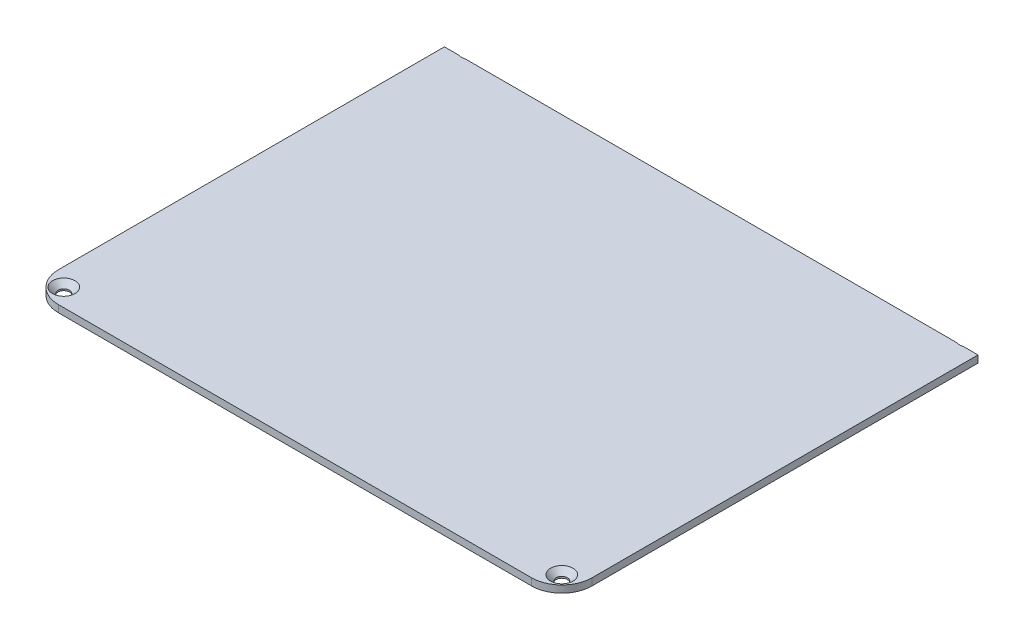
ISO-10303-21;
HEADER;
FILE_DESCRIPTION(('STEP AP214'),'2;1');
FILE_NAME('part.step','',(''),(''),'','','');
FILE_SCHEMA(('AUTOMOTIVE_DESIGN { 1 0 10303 214 1 1 1 1 }'));
ENDSEC;
DATA;
#1=APPLICATION_CONTEXT('core data for automotive mechanical design processes');
#2=APPLICATION_PROTOCOL_DEFINITION('international standard','automotive_design',2000,#1);
#3=PRODUCT_CONTEXT('',#1,'mechanical');
#4=PRODUCT('Part','Part','',(#3));
#5=PRODUCT_RELATED_PRODUCT_CATEGORY('part','',(#4));
#6=PRODUCT_DEFINITION_FORMATION('','',#4);
#7=PRODUCT_DEFINITION_CONTEXT('part definition',#1,'design');
#8=PRODUCT_DEFINITION('design','',#6,#7);
#9=PRODUCT_DEFINITION_SHAPE('','',#8);
#10=(LENGTH_UNIT() NAMED_UNIT(*) SI_UNIT(.MILLI.,.METRE.));
#11=(NAMED_UNIT(*) PLANE_ANGLE_UNIT() SI_UNIT($,.RADIAN.));
#12=(NAMED_UNIT(*) SI_UNIT($,.STERADIAN.) SOLID_ANGLE_UNIT());
#13=UNCERTAINTY_MEASURE_WITH_UNIT(LENGTH_MEASURE(1.E-05),#10,'distance_accuracy_value','');
#14=(GEOMETRIC_REPRESENTATION_CONTEXT(3) GLOBAL_UNCERTAINTY_ASSIGNED_CONTEXT((#13)) GLOBAL_UNIT_ASSIGNED_CONTEXT((#10,
#11,#12)) REPRESENTATION_CONTEXT('',''));
#15=CARTESIAN_POINT('',(0.,0.,0.));
#16=DIRECTION('',(0.,0.,1.));
#17=DIRECTION('',(1.,0.,0.));
#18=AXIS2_PLACEMENT_3D('',#15,#16,#17);
#19=CARTESIAN_POINT('',(0.,4.,0.));
#20=DIRECTION('',(0.,-1.,0.));
#21=DIRECTION('',(0.,0.,-1.));
#22=AXIS2_PLACEMENT_3D('',#19,#20,#21);
#23=PLANE('',#22);
#24=CARTESIAN_POINT('',(10.,4.,-10.));
#25=DIRECTION('',(0.,1.,0.));
#26=DIRECTION('',(0.,0.,1.));
#27=AXIS2_PLACEMENT_3D('',#24,#25,#26);
#28=CIRCLE('',#27,6.3);
#29=CARTESIAN_POINT('',(10.,4.,-3.7));
#30=VERTEX_POINT('',#29);
#31=EDGE_CURVE('E236',#30,#30,#28,.T.);
#32=ORIENTED_EDGE('',*,*,#31,.F.);
#33=EDGE_LOOP('',(#32));
#34=FACE_BOUND('',#33,.T.);
#35=CARTESIAN_POINT('',(290.,4.,-10.));
#36=DIRECTION('',(0.,1.,0.));
#37=DIRECTION('',(0.,0.,1.));
#38=AXIS2_PLACEMENT_3D('',#35,#36,#37);
#39=CIRCLE('',#38,6.29999999999997);
#40=CARTESIAN_POINT('',(290.,4.,-3.70000000000003));
#41=VERTEX_POINT('',#40);
#42=EDGE_CURVE('E229',#41,#41,#39,.T.);
#43=ORIENTED_EDGE('',*,*,#42,.F.);
#44=EDGE_LOOP('',(#43));
#45=FACE_BOUND('',#44,.T.);
#46=CARTESIAN_POINT('',(290.,4.,-240.));
#47=DIRECTION('',(0.,1.,0.));
#48=DIRECTION('',(0.,0.,1.));
#49=AXIS2_PLACEMENT_3D('',#46,#47,#48);
#50=CIRCLE('',#49,6.29999999999997);
#51=CARTESIAN_POINT('',(288.07906272877,4.,-234.));
#52=VERTEX_POINT('',#51);
#53=CARTESIAN_POINT('',(291.92093727123,4.,-234.));
#54=VERTEX_POINT('',#53);
#55=EDGE_CURVE('E58',#52,#54,#50,.T.);
#56=ORIENTED_EDGE('',*,*,#55,.F.);
#57=DIRECTION('',(-1.,0.,0.));
#58=VECTOR('',#57,1.);
#59=CARTESIAN_POINT('',(0.,4.,-234.));
#60=LINE('',#59,#58);
#61=CARTESIAN_POINT('',(11.9209372712298,4.,-234.));
#62=VERTEX_POINT('',#61);
#63=EDGE_CURVE('E64',#52,#62,#60,.T.);
#64=ORIENTED_EDGE('',*,*,#63,.T.);
#65=CARTESIAN_POINT('',(10.,4.,-240.));
#66=DIRECTION('',(0.,1.,0.));
#67=DIRECTION('',(0.,0.,1.));
#68=AXIS2_PLACEMENT_3D('',#65,#66,#67);
#69=CIRCLE('',#68,6.3);
#70=CARTESIAN_POINT('',(8.07906272877016,4.,-234.));
#71=VERTEX_POINT('',#70);
#72=EDGE_CURVE('E111',#71,#62,#69,.T.);
#73=ORIENTED_EDGE('',*,*,#72,.F.);
#74=CARTESIAN_POINT('',(0.,4.,-234.));
#75=VERTEX_POINT('',#74);
#76=EDGE_CURVE('E118',#71,#75,#60,.T.);
#77=ORIENTED_EDGE('',*,*,#76,.T.);
#78=DIRECTION('',(0.,0.,1.));
#79=VECTOR('',#78,1.);
#80=CARTESIAN_POINT('',(0.,4.,0.));
#81=LINE('',#80,#79);
#82=CARTESIAN_POINT('',(0.,4.,-17.));
#83=VERTEX_POINT('',#82);
#84=EDGE_CURVE('E140',#75,#83,#81,.T.);
#85=ORIENTED_EDGE('',*,*,#84,.T.);
#86=CARTESIAN_POINT('',(17.,4.,-17.));
#87=DIRECTION('',(0.,-1.,0.));
#88=DIRECTION('',(0.,0.,-1.));
#89=AXIS2_PLACEMENT_3D('',#86,#87,#88);
#90=CIRCLE('',#89,17.);
#91=CARTESIAN_POINT('',(17.,4.,0.));
#92=VERTEX_POINT('',#91);
#93=EDGE_CURVE('E158',#83,#92,#90,.F.);
#94=ORIENTED_EDGE('',*,*,#93,.T.);
#95=DIRECTION('',(1.,0.,0.));
#96=VECTOR('',#95,1.);
#97=CARTESIAN_POINT('',(0.,4.,0.));
#98=LINE('',#97,#96);
#99=CARTESIAN_POINT('',(283.,4.,0.));
#100=VERTEX_POINT('',#99);
#101=EDGE_CURVE('E218',#92,#100,#98,.T.);
#102=ORIENTED_EDGE('',*,*,#101,.T.);
#103=CARTESIAN_POINT('',(283.,4.,-17.));
#104=DIRECTION('',(0.,-1.,0.));
#105=DIRECTION('',(0.,0.,-1.));
#106=AXIS2_PLACEMENT_3D('',#103,#104,#105);
#107=CIRCLE('',#106,17.);
#108=CARTESIAN_POINT('',(300.,4.,-17.));
#109=VERTEX_POINT('',#108);
#110=EDGE_CURVE('E160',#100,#109,#107,.F.);
#111=ORIENTED_EDGE('',*,*,#110,.T.);
#112=DIRECTION('',(0.,0.,-1.));
#113=VECTOR('',#112,1.);
#114=CARTESIAN_POINT('',(300.,4.,0.));
#115=LINE('',#114,#113);
#116=CARTESIAN_POINT('',(300.,4.,-234.));
#117=VERTEX_POINT('',#116);
#118=EDGE_CURVE('E123',#109,#117,#115,.T.);
#119=ORIENTED_EDGE('',*,*,#118,.T.);
#120=EDGE_CURVE('E110',#117,#54,#60,.T.);
#121=ORIENTED_EDGE('',*,*,#120,.T.);
#122=EDGE_LOOP('',(#56,#64,#73,#77,#85,#94,#102,#111,#119,#121));
#123=FACE_BOUND('',#122,.T.);
#124=ADVANCED_FACE('F39',(#34,#45,#123),#23,.F.);
#125=CARTESIAN_POINT('',(0.,4.,0.));
#126=DIRECTION('',(1.,0.,0.));
#127=DIRECTION('',(0.,0.,-1.));
#128=AXIS2_PLACEMENT_3D('',#125,#126,#127);
#129=PLANE('',#128);
#130=DIRECTION('',(0.,0.,1.));
#131=VECTOR('',#130,1.);
#132=CARTESIAN_POINT('',(0.,0.,0.));
#133=LINE('',#132,#131);
#134=CARTESIAN_POINT('',(0.,0.,-234.));
#135=VERTEX_POINT('',#134);
#136=CARTESIAN_POINT('',(0.,0.,-17.));
#137=VERTEX_POINT('',#136);
#138=EDGE_CURVE('E127',#135,#137,#133,.T.);
#139=ORIENTED_EDGE('',*,*,#138,.T.);
#140=DIRECTION('',(0.,-1.,0.));
#141=VECTOR('',#140,1.);
#142=CARTESIAN_POINT('',(0.,4.,-17.));
#143=LINE('',#142,#141);
#144=EDGE_CURVE('E162',#137,#83,#143,.F.);
#145=ORIENTED_EDGE('',*,*,#144,.T.);
#146=ORIENTED_EDGE('',*,*,#84,.F.);
#147=DIRECTION('',(0.,-1.,0.));
#148=VECTOR('',#147,1.);
#149=CARTESIAN_POINT('',(0.,4.,-234.));
#150=LINE('',#149,#148);
#151=EDGE_CURVE('E122',#75,#135,#150,.T.);
#152=ORIENTED_EDGE('',*,*,#151,.T.);
#153=EDGE_LOOP('',(#139,#145,#146,#152));
#154=FACE_BOUND('',#153,.T.);
#155=ADVANCED_FACE('F178',(#154),#129,.F.);
#156=CARTESIAN_POINT('',(0.,4.,0.));
#157=DIRECTION('',(0.,0.,-1.));
#158=DIRECTION('',(-1.,0.,0.));
#159=AXIS2_PLACEMENT_3D('',#156,#157,#158);
#160=PLANE('',#159);
#161=DIRECTION('',(1.,0.,0.));
#162=VECTOR('',#161,1.);
#163=CARTESIAN_POINT('',(0.,0.,0.));
#164=LINE('',#163,#162);
#165=CARTESIAN_POINT('',(17.,0.,0.));
#166=VERTEX_POINT('',#165);
#167=CARTESIAN_POINT('',(283.,0.,0.));
#168=VERTEX_POINT('',#167);
#169=EDGE_CURVE('E131',#166,#168,#164,.T.);
#170=ORIENTED_EDGE('',*,*,#169,.T.);
#171=DIRECTION('',(0.,-1.,0.));
#172=VECTOR('',#171,1.);
#173=CARTESIAN_POINT('',(283.,4.,0.));
#174=LINE('',#173,#172);
#175=EDGE_CURVE('E156',#168,#100,#174,.F.);
#176=ORIENTED_EDGE('',*,*,#175,.T.);
#177=ORIENTED_EDGE('',*,*,#101,.F.);
#178=DIRECTION('',(0.,-1.,0.));
#179=VECTOR('',#178,1.);
#180=CARTESIAN_POINT('',(17.,4.,0.));
#181=LINE('',#180,#179);
#182=EDGE_CURVE('E153',#92,#166,#181,.T.);
#183=ORIENTED_EDGE('',*,*,#182,.T.);
#184=EDGE_LOOP('',(#170,#176,#177,#183));
#185=FACE_BOUND('',#184,.T.);
#186=ADVANCED_FACE('F215',(#185),#160,.F.);
#187=CARTESIAN_POINT('',(300.,4.,0.));
#188=DIRECTION('',(-1.,0.,0.));
#189=DIRECTION('',(0.,0.,1.));
#190=AXIS2_PLACEMENT_3D('',#187,#188,#189);
#191=PLANE('',#190);
#192=ORIENTED_EDGE('',*,*,#118,.F.);
#193=DIRECTION('',(0.,-1.,0.));
#194=VECTOR('',#193,1.);
#195=CARTESIAN_POINT('',(300.,4.,-17.));
#196=LINE('',#195,#194);
#197=CARTESIAN_POINT('',(300.,0.,-17.));
#198=VERTEX_POINT('',#197);
#199=EDGE_CURVE('E146',#109,#198,#196,.T.);
#200=ORIENTED_EDGE('',*,*,#199,.T.);
#201=DIRECTION('',(0.,0.,-1.));
#202=VECTOR('',#201,1.);
#203=CARTESIAN_POINT('',(300.,0.,0.));
#204=LINE('',#203,#202);
#205=CARTESIAN_POINT('',(300.,0.,-234.));
#206=VERTEX_POINT('',#205);
#207=EDGE_CURVE('E135',#198,#206,#204,.T.);
#208=ORIENTED_EDGE('',*,*,#207,.T.);
#209=DIRECTION('',(0.,-1.,0.));
#210=VECTOR('',#209,1.);
#211=CARTESIAN_POINT('',(300.,4.,-234.));
#212=LINE('',#211,#210);
#213=EDGE_CURVE('E143',#117,#206,#212,.T.);
#214=ORIENTED_EDGE('',*,*,#213,.F.);
#215=EDGE_LOOP('',(#192,#200,#208,#214));
#216=FACE_BOUND('',#215,.T.);
#217=ADVANCED_FACE('F189',(#216),#191,.F.);
#218=CARTESIAN_POINT('',(0.,4.,-234.));
#219=DIRECTION('',(0.,0.,1.));
#220=DIRECTION('',(1.,0.,0.));
#221=AXIS2_PLACEMENT_3D('',#218,#219,#220);
#222=PLANE('',#221);
#223=ORIENTED_EDGE('',*,*,#63,.F.);
#224=CARTESIAN_POINT('',(269.190245400378,19.3574672225657,-234.));
#225=CARTESIAN_POINT('',(269.709030300661,18.8590335236249,-234.));
#226=CARTESIAN_POINT('',(270.228488505162,18.361297390707,-234.));
#227=CARTESIAN_POINT('',(271.269225122258,17.3676755174882,-234.));
#228=CARTESIAN_POINT('',(271.79050363237,16.8717898793595,-234.));
#229=CARTESIAN_POINT('',(272.83676578259,15.880988721276,-234.));
#230=CARTESIAN_POINT('',(273.36175571768,15.3860798411432,-234.));
#231=CARTESIAN_POINT('',(274.414634628033,14.3993970225166,-234.));
#232=CARTESIAN_POINT('',(274.942523485217,13.9076229580727,-234.));
#233=CARTESIAN_POINT('',(276.065632732858,12.8695397292352,-234.));
#234=CARTESIAN_POINT('',(276.661341408261,12.323757094228,-234.));
#235=CARTESIAN_POINT('',(277.560073295153,11.5107080589867,-234.));
#236=CARTESIAN_POINT('',(277.860534150705,11.2406097248272,-234.));
#237=CARTESIAN_POINT('',(278.463535427959,10.7027450238927,-234.));
#238=CARTESIAN_POINT('',(278.766075837923,10.4349786439732,-234.));
#239=CARTESIAN_POINT('',(279.373198832351,9.90277008944649,-234.));
#240=CARTESIAN_POINT('',(279.677777288132,9.63832321095495,-234.));
#241=CARTESIAN_POINT('',(280.290057352683,9.11307180039887,-234.));
#242=CARTESIAN_POINT('',(280.597758914883,8.85226721415961,-234.));
#243=CARTESIAN_POINT('',(281.217010890757,8.33540354769458,-234.));
#244=CARTESIAN_POINT('',(281.528560411096,8.07934339928055,-234.));
#245=CARTESIAN_POINT('',(282.156619244923,7.5733937702437,-234.));
#246=CARTESIAN_POINT('',(282.473128201179,7.32350384848325,-234.));
#247=CARTESIAN_POINT('',(282.992945184643,6.92401777257441,-234.));
#248=CARTESIAN_POINT('',(283.194298076628,6.77187956898466,-234.));
#249=CARTESIAN_POINT('',(283.599998246704,6.47162371897631,-234.));
#250=CARTESIAN_POINT('',(283.804345618082,6.32350619822472,-234.));
#251=CARTESIAN_POINT('',(284.216948334804,6.03200613485343,-234.));
#252=CARTESIAN_POINT('',(284.425209996336,5.88863250211753,-234.));
#253=CARTESIAN_POINT('',(284.845949351493,5.60820015951851,-234.));
#254=CARTESIAN_POINT('',(285.058426856514,5.47114116806479,-234.));
#255=CARTESIAN_POINT('',(285.484097049575,5.20772799955743,-234.));
#256=CARTESIAN_POINT('',(285.697190702347,5.08121469703576,-234.));
#257=CARTESIAN_POINT('',(286.129067286359,4.83808481964387,-234.));
#258=CARTESIAN_POINT('',(286.347851577447,4.72147063920677,-234.));
#259=CARTESIAN_POINT('',(286.791188024546,4.5014370609496,-234.));
#260=CARTESIAN_POINT('',(287.015720630059,4.39797863876526,-234.));
#261=CARTESIAN_POINT('',(287.471652475265,4.20766618311422,-234.));
#262=CARTESIAN_POINT('',(287.703046219558,4.1207992547408,-234.));
#263=CARTESIAN_POINT('',(288.087096298579,3.9959745112749,-234.));
#264=CARTESIAN_POINT('',(288.237711294082,3.95173018079003,-234.));
#265=CARTESIAN_POINT('',(288.541509479053,3.87297982880822,-234.));
#266=CARTESIAN_POINT('',(288.694692882717,3.83847462384336,-234.));
#267=CARTESIAN_POINT('',(289.002718588543,3.78044159972715,-234.));
#268=CARTESIAN_POINT('',(289.157555289801,3.75688437073816,-234.));
#269=CARTESIAN_POINT('',(289.468562086524,3.72150763580314,-234.));
#270=CARTESIAN_POINT('',(289.624732095206,3.70968737169728,-234.));
#271=CARTESIAN_POINT('',(289.971634582504,3.69705167238178,-234.));
#272=CARTESIAN_POINT('',(290.162483525692,3.69919526679001,-234.));
#273=CARTESIAN_POINT('',(290.543117649831,3.7215315418545,-234.));
#274=CARTESIAN_POINT('',(290.732902676803,3.74172677053325,-234.));
#275=CARTESIAN_POINT('',(291.110661532791,3.79906102050487,-234.));
#276=CARTESIAN_POINT('',(291.298624665707,3.83626956943628,-234.));
#277=CARTESIAN_POINT('',(291.670897652874,3.92569074398454,-234.));
#278=CARTESIAN_POINT('',(291.855207038133,3.97790528259125,-234.));
#279=CARTESIAN_POINT('',(292.395660376726,4.1516647640086,-234.));
#280=CARTESIAN_POINT('',(292.745964119443,4.29148543523251,-234.));
#281=CARTESIAN_POINT('',(293.259519205313,4.52651335587914,-234.));
#282=CARTESIAN_POINT('',(293.428879868628,4.60916497044079,-234.));
#283=CARTESIAN_POINT('',(293.764019058669,4.78146743049723,-234.));
#284=CARTESIAN_POINT('',(293.929797934381,4.87111759014037,-234.));
#285=CARTESIAN_POINT('',(294.260427765172,5.05746779421679,-234.));
#286=CARTESIAN_POINT('',(294.425231982083,5.15424997694629,-234.));
#287=CARTESIAN_POINT('',(294.751880789206,5.35268216740628,-234.));
#288=CARTESIAN_POINT('',(294.913725317771,5.45433227637172,-234.));
#289=CARTESIAN_POINT('',(295.234667087149,5.66157903639564,-234.));
#290=CARTESIAN_POINT('',(295.393766506922,5.76717232484793,-234.));
#291=CARTESIAN_POINT('',(295.709667923513,5.98171926249003,-234.));
#292=CARTESIAN_POINT('',(295.866470015024,6.09067277259986,-234.));
#293=CARTESIAN_POINT('',(296.201029397036,6.3276783867472,-234.));
#294=CARTESIAN_POINT('',(296.378468863534,6.45617851006558,-234.));
#295=CARTESIAN_POINT('',(296.731069455399,6.71627193824177,-234.));
#296=CARTESIAN_POINT('',(296.906230498284,6.84786535459858,-234.));
#297=CARTESIAN_POINT('',(297.428820044469,7.24653967267187,-234.));
#298=CARTESIAN_POINT('',(297.773305367359,7.5174790716851,-234.));
#299=CARTESIAN_POINT('',(298.456546745393,8.06687377373283,-234.));
#300=CARTESIAN_POINT('',(298.795299052251,8.34533370672021,-234.));
#301=CARTESIAN_POINT('',(299.46819589452,8.90770378620207,-234.));
#302=CARTESIAN_POINT('',(299.802340776933,9.19161351835868,-234.));
#303=CARTESIAN_POINT('',(300.467930951895,9.76436058495172,-234.));
#304=CARTESIAN_POINT('',(300.799366617077,10.0532090805222,-234.));
#305=CARTESIAN_POINT('',(301.459372065764,10.6341681609186,-234.));
#306=CARTESIAN_POINT('',(301.787941802019,10.9262787993471,-234.));
#307=CARTESIAN_POINT('',(302.442645034994,11.5129767071093,-234.));
#308=CARTESIAN_POINT('',(302.768779372462,11.8075630393165,-234.));
#309=CARTESIAN_POINT('',(303.419152801773,12.3988215231793,-234.));
#310=CARTESIAN_POINT('',(303.743391884673,12.695493684663,-234.));
#311=CARTESIAN_POINT('',(304.634466232775,13.5151128786331,-234.));
#312=CARTESIAN_POINT('',(305.199678538602,14.0398239642659,-234.));
#313=CARTESIAN_POINT('',(306.326631262988,15.0930711044456,-234.));
#314=CARTESIAN_POINT('',(306.888371314176,15.6216075513023,-234.));
#315=CARTESIAN_POINT('',(308.006409527906,16.6788766003369,-234.));
#316=CARTESIAN_POINT('',(308.562720863827,17.2075952840056,-234.));
#317=CARTESIAN_POINT('',(309.673193598743,18.2671493132842,-234.));
#318=CARTESIAN_POINT('',(310.227355254908,18.7979843892692,-234.));
#319=CARTESIAN_POINT('',(310.780756658266,19.3296058052403,-234.));
#320=B_SPLINE_CURVE_WITH_KNOTS('',3,(#224,#225,#226,#227,#228,#229,#230,#231,#232,#233,#234,
#235,#236,#237,#238,#239,#240,#241,#242,#243,#244,#245,#246,#247,#248,#249,#250,#251,#252,#253,
#254,#255,#256,#257,#258,#259,#260,#261,#262,#263,#264,#265,#266,#267,#268,#269,#270,#271,#272,
#273,#274,#275,#276,#277,#278,#279,#280,#281,#282,#283,#284,#285,#286,#287,#288,#289,#290,#291,
#292,#293,#294,#295,#296,#297,#298,#299,#300,#301,#302,#303,#304,#305,#306,#307,#308,#309,#310,
#311,#312,#313,#314,#315,#316,#317,#318,#319),.UNSPECIFIED.,.F.,.F.,(4,2,2,2,2,2,2,2,2,2,2,2,2,
2,2,2,2,2,2,2,2,2,2,2,2,2,2,2,2,2,2,2,2,2,2,2,2,2,2,2,2,2,2,2,2,2,2,4),(0.,2.15828093939026,
4.316679332126,6.48114180585279,8.64551676096695,11.0692478801546,12.2812900795891,
13.4933254426287,14.7033867412884,15.9134300225255,17.1231974738996,18.3328781815709,
19.0899398623899,19.847025178097,20.6054598790625,21.363860726134,22.1071149201384,
22.8505483857259,23.5917224133614,24.332318035527,24.8029822449534,25.2736859033372,
25.7431176830574,26.2125191374352,26.7841987064211,27.3559589818094,27.93007702296,
28.5042682861755,29.632638608174,30.1979254503483,30.7631569642556,31.3364281993593,
31.9097113615758,32.4825163378438,33.055297637381,33.7125027959609,34.3697316802046,
35.6843724726941,36.9998419413386,38.315211790383,39.6341046346207,40.9530191824582,
42.2714551515776,43.5898973371359,45.9035428434212,48.2174290860641,50.5198628381595,
52.8220120830353),.UNSPECIFIED.);
#321=EDGE_CURVE('E11',#52,#54,#320,.T.);
#322=ORIENTED_EDGE('',*,*,#321,.T.);
#323=ORIENTED_EDGE('',*,*,#120,.F.);
#324=ORIENTED_EDGE('',*,*,#213,.T.);
#325=DIRECTION('',(-1.,0.,0.));
#326=VECTOR('',#325,1.);
#327=CARTESIAN_POINT('',(0.,0.,-234.));
#328=LINE('',#327,#326);
#329=EDGE_CURVE('E138',#206,#135,#328,.T.);
#330=ORIENTED_EDGE('',*,*,#329,.T.);
#331=ORIENTED_EDGE('',*,*,#151,.F.);
#332=ORIENTED_EDGE('',*,*,#76,.F.);
#333=CARTESIAN_POINT('',(-10.8097545996226,19.3574672225658,-234.));
#334=CARTESIAN_POINT('',(-10.2909696993396,18.8590335236249,-234.));
#335=CARTESIAN_POINT('',(-9.77151149483827,18.361297390707,-234.));
#336=CARTESIAN_POINT('',(-8.73077487774222,17.3676755174882,-234.));
#337=CARTESIAN_POINT('',(-8.20949636763046,16.8717898793595,-234.));
#338=CARTESIAN_POINT('',(-7.16323421741064,15.880988721276,-234.));
#339=CARTESIAN_POINT('',(-6.63824428232061,15.3860798411432,-234.));
#340=CARTESIAN_POINT('',(-5.58536537196743,14.3993970225166,-234.));
#341=CARTESIAN_POINT('',(-5.05747651478338,13.9076229580727,-234.));
#342=CARTESIAN_POINT('',(-3.93436726714248,12.8695397292352,-234.));
#343=CARTESIAN_POINT('',(-3.33865859173926,12.323757094228,-234.));
#344=CARTESIAN_POINT('',(-2.43992670484744,11.5107080589867,-234.));
#345=CARTESIAN_POINT('',(-2.13946584929516,11.2406097248271,-234.));
#346=CARTESIAN_POINT('',(-1.53646457204055,10.7027450238927,-234.));
#347=CARTESIAN_POINT('',(-1.23392416207734,10.4349786439732,-234.));
#348=CARTESIAN_POINT('',(-0.626801167649482,9.90277008944645,-234.));
#349=CARTESIAN_POINT('',(-0.32222271186832,9.6383232109549,-234.));
#350=CARTESIAN_POINT('',(0.290057352682868,9.11307180039882,-234.));
#351=CARTESIAN_POINT('',(0.597758914882627,8.85226721415955,-234.));
#352=CARTESIAN_POINT('',(1.21701089075719,8.33540354769453,-234.));
#353=CARTESIAN_POINT('',(1.52856041109612,8.07934339928049,-234.));
#354=CARTESIAN_POINT('',(2.15661924492341,7.57339377024363,-234.));
#355=CARTESIAN_POINT('',(2.47312820117899,7.32350384848318,-234.));
#356=CARTESIAN_POINT('',(2.99294518464343,6.92401777257432,-234.));
#357=CARTESIAN_POINT('',(3.1942980766277,6.77187956898457,-234.));
#358=CARTESIAN_POINT('',(3.59999824670386,6.47162371897621,-234.));
#359=CARTESIAN_POINT('',(3.80434561808196,6.32350619822462,-234.));
#360=CARTESIAN_POINT('',(4.21694833480381,6.03200613485333,-234.));
#361=CARTESIAN_POINT('',(4.42520999633589,5.88863250211744,-234.));
#362=CARTESIAN_POINT('',(4.845949351493,5.60820015951842,-234.));
#363=CARTESIAN_POINT('',(5.05842685651404,5.4711411680647,-234.));
#364=CARTESIAN_POINT('',(5.48409704957491,5.20772799955736,-234.));
#365=CARTESIAN_POINT('',(5.69719070234672,5.0812146970357,-234.));
#366=CARTESIAN_POINT('',(6.12906728635912,4.83808481964381,-234.));
#367=CARTESIAN_POINT('',(6.34785157744645,4.72147063920671,-234.));
#368=CARTESIAN_POINT('',(6.7911880245463,4.50143706094955,-234.));
#369=CARTESIAN_POINT('',(7.01572063005894,4.39797863876521,-234.));
#370=CARTESIAN_POINT('',(7.47165247526524,4.20766618311418,-234.));
#371=CARTESIAN_POINT('',(7.70304621955746,4.12079925474076,-234.));
#372=CARTESIAN_POINT('',(8.08709629857858,3.99597451127485,-234.));
#373=CARTESIAN_POINT('',(8.23771129408164,3.95173018078998,-234.));
#374=CARTESIAN_POINT('',(8.54150947905262,3.87297982880817,-234.));
#375=CARTESIAN_POINT('',(8.69469288271693,3.83847462384331,-234.));
#376=CARTESIAN_POINT('',(9.00271858854265,3.7804415997271,-234.));
#377=CARTESIAN_POINT('',(9.15755528980084,3.7568843707381,-234.));
#378=CARTESIAN_POINT('',(9.46856208652425,3.72150763580308,-234.));
#379=CARTESIAN_POINT('',(9.6247320952059,3.70968737169722,-234.));
#380=CARTESIAN_POINT('',(9.97163458250375,3.69705167238173,-234.));
#381=CARTESIAN_POINT('',(10.1624835256918,3.69919526678996,-234.));
#382=CARTESIAN_POINT('',(10.5431176498309,3.72153154185445,-234.));
#383=CARTESIAN_POINT('',(10.7329026768025,3.74172677053319,-234.));
#384=CARTESIAN_POINT('',(11.1106615327908,3.79906102050481,-234.));
#385=CARTESIAN_POINT('',(11.298624665707,3.83626956943622,-234.));
#386=CARTESIAN_POINT('',(11.6708976528734,3.92569074398447,-234.));
#387=CARTESIAN_POINT('',(11.8552070381331,3.97790528259118,-234.));
#388=CARTESIAN_POINT('',(12.3956603767257,4.15166476400852,-234.));
#389=CARTESIAN_POINT('',(12.745964119443,4.29148543523242,-234.));
#390=CARTESIAN_POINT('',(13.2595192053129,4.52651335587905,-234.));
#391=CARTESIAN_POINT('',(13.4288798686276,4.6091649704407,-234.));
#392=CARTESIAN_POINT('',(13.7640190586693,4.78146743049712,-234.));
#393=CARTESIAN_POINT('',(13.9297979343806,4.87111759014025,-234.));
#394=CARTESIAN_POINT('',(14.2604277651719,5.05746779421665,-234.));
#395=CARTESIAN_POINT('',(14.4252319820826,5.15424997694613,-234.));
#396=CARTESIAN_POINT('',(14.7518807892058,5.35268216740611,-234.));
#397=CARTESIAN_POINT('',(14.9137253177709,5.45433227637155,-234.));
#398=CARTESIAN_POINT('',(15.2346670871493,5.66157903639547,-234.));
#399=CARTESIAN_POINT('',(15.3937665069215,5.76717232484777,-234.));
#400=CARTESIAN_POINT('',(15.709667923513,5.98171926248986,-234.));
#401=CARTESIAN_POINT('',(15.8664700150236,6.09067277259968,-234.));
#402=CARTESIAN_POINT('',(16.2010293970357,6.32767838674702,-234.));
#403=CARTESIAN_POINT('',(16.3784688635339,6.4561785100654,-234.));
#404=CARTESIAN_POINT('',(16.7310694553988,6.71627193824158,-234.));
#405=CARTESIAN_POINT('',(16.9062304982842,6.84786535459839,-234.));
#406=CARTESIAN_POINT('',(17.4288200444691,7.24653967267166,-234.));
#407=CARTESIAN_POINT('',(17.7733053673591,7.51747907168488,-234.));
#408=CARTESIAN_POINT('',(18.4565467453928,8.0668737737326,-234.));
#409=CARTESIAN_POINT('',(18.7952990522503,8.34533370671997,-234.));
#410=CARTESIAN_POINT('',(19.4681958945201,8.9077037862018,-234.));
#411=CARTESIAN_POINT('',(19.8023407769331,9.19161351835839,-234.));
#412=CARTESIAN_POINT('',(20.4679309518949,9.7643605849514,-234.));
#413=CARTESIAN_POINT('',(20.7993666170767,10.0532090805219,-234.));
#414=CARTESIAN_POINT('',(21.4593720657637,10.6341681609183,-234.));
#415=CARTESIAN_POINT('',(21.7879418020185,10.9262787993468,-234.));
#416=CARTESIAN_POINT('',(22.4426450349934,11.5129767071089,-234.));
#417=CARTESIAN_POINT('',(22.7687793724612,11.8075630393161,-234.));
#418=CARTESIAN_POINT('',(23.4191528017725,12.3988215231789,-234.));
#419=CARTESIAN_POINT('',(23.7433918846726,12.6954936846626,-234.));
#420=CARTESIAN_POINT('',(24.6344662327746,13.5151128786327,-234.));
#421=CARTESIAN_POINT('',(25.1996785386019,14.0398239642654,-234.));
#422=CARTESIAN_POINT('',(26.3266312629879,15.0930711044451,-234.));
#423=CARTESIAN_POINT('',(26.8883713141751,15.6216075513017,-234.));
#424=CARTESIAN_POINT('',(28.0064095279056,16.6788766003363,-234.));
#425=CARTESIAN_POINT('',(28.5627208638261,17.207595284005,-234.));
#426=CARTESIAN_POINT('',(29.6731935987425,18.2671493132836,-234.));
#427=CARTESIAN_POINT('',(30.2273552549074,18.7979843892686,-234.));
#428=CARTESIAN_POINT('',(30.7807566582657,19.3296058052396,-234.));
#429=B_SPLINE_CURVE_WITH_KNOTS('',3,(#333,#334,#335,#336,#337,#338,#339,#340,#341,#342,#343,
#344,#345,#346,#347,#348,#349,#350,#351,#352,#353,#354,#355,#356,#357,#358,#359,#360,#361,#362,
#363,#364,#365,#366,#367,#368,#369,#370,#371,#372,#373,#374,#375,#376,#377,#378,#379,#380,#381,
#382,#383,#384,#385,#386,#387,#388,#389,#390,#391,#392,#393,#394,#395,#396,#397,#398,#399,#400,
#401,#402,#403,#404,#405,#406,#407,#408,#409,#410,#411,#412,#413,#414,#415,#416,#417,#418,#419,
#420,#421,#422,#423,#424,#425,#426,#427,#428),.UNSPECIFIED.,.F.,.F.,(4,2,2,2,2,2,2,2,2,2,2,2,2,
2,2,2,2,2,2,2,2,2,2,2,2,2,2,2,2,2,2,2,2,2,2,2,2,2,2,2,2,2,2,2,2,2,2,4),(0.,2.15828093939032,
4.3166793321261,6.48114180585292,8.64551676096707,11.0692478801548,12.2812900795893,
13.4933254426288,14.7033867412886,15.9134300225257,17.1231974738998,18.3328781815711,
19.0899398623902,19.8470251780973,20.6054598790628,21.3638607261343,22.1071149201386,
22.8505483857262,23.5917224133616,24.3323180355272,24.8029822449536,25.2736859033374,
25.7431176830577,26.2125191374355,26.7841987064213,27.3559589818096,27.9300770229603,
28.5042682861756,29.6326386081742,30.1979254503484,30.7631569642557,31.3364281993593,
31.9097113615759,32.4825163378438,33.0552976373811,33.7125027959609,34.3697316802046,
35.6843724726941,36.9998419413385,38.3152117903829,39.6341046346206,40.953019182458,
42.2714551515774,43.5898973371356,45.9035428434208,48.2174290860637,50.519862838159,
52.8220120830348),.UNSPECIFIED.);
#430=EDGE_CURVE('E52',#71,#62,#429,.T.);
#431=ORIENTED_EDGE('',*,*,#430,.T.);
#432=EDGE_LOOP('',(#223,#322,#323,#324,#330,#331,#332,#431));
#433=FACE_BOUND('',#432,.T.);
#434=ADVANCED_FACE('F115',(#433),#222,.F.);
#435=CARTESIAN_POINT('',(0.,0.,0.));
#436=DIRECTION('',(0.,-1.,0.));
#437=DIRECTION('',(0.,0.,-1.));
#438=AXIS2_PLACEMENT_3D('',#435,#436,#437);
#439=PLANE('',#438);
#440=CARTESIAN_POINT('',(10.,0.,-10.));
#441=DIRECTION('',(0.,1.,0.));
#442=DIRECTION('',(0.,0.,1.));
#443=AXIS2_PLACEMENT_3D('',#440,#441,#442);
#444=CIRCLE('',#443,3.2);
#445=CARTESIAN_POINT('',(10.,0.,-6.8));
#446=VERTEX_POINT('',#445);
#447=EDGE_CURVE('E193',#446,#446,#444,.T.);
#448=ORIENTED_EDGE('',*,*,#447,.T.);
#449=EDGE_LOOP('',(#448));
#450=FACE_BOUND('',#449,.T.);
#451=CARTESIAN_POINT('',(290.,0.,-10.));
#452=DIRECTION('',(0.,1.,0.));
#453=DIRECTION('',(0.,0.,1.));
#454=AXIS2_PLACEMENT_3D('',#451,#452,#453);
#455=CIRCLE('',#454,3.19999999999998);
#456=CARTESIAN_POINT('',(290.,0.,-6.80000000000002));
#457=VERTEX_POINT('',#456);
#458=EDGE_CURVE('E112',#457,#457,#455,.T.);
#459=ORIENTED_EDGE('',*,*,#458,.T.);
#460=EDGE_LOOP('',(#459));
#461=FACE_BOUND('',#460,.T.);
#462=ORIENTED_EDGE('',*,*,#207,.F.);
#463=CARTESIAN_POINT('',(283.,0.,-17.));
#464=DIRECTION('',(0.,-1.,0.));
#465=DIRECTION('',(0.,0.,-1.));
#466=AXIS2_PLACEMENT_3D('',#463,#464,#465);
#467=CIRCLE('',#466,17.);
#468=EDGE_CURVE('E151',#198,#168,#467,.T.);
#469=ORIENTED_EDGE('',*,*,#468,.T.);
#470=ORIENTED_EDGE('',*,*,#169,.F.);
#471=CARTESIAN_POINT('',(17.,0.,-17.));
#472=DIRECTION('',(0.,-1.,0.));
#473=DIRECTION('',(0.,0.,-1.));
#474=AXIS2_PLACEMENT_3D('',#471,#472,#473);
#475=CIRCLE('',#474,17.);
#476=EDGE_CURVE('E149',#166,#137,#475,.T.);
#477=ORIENTED_EDGE('',*,*,#476,.T.);
#478=ORIENTED_EDGE('',*,*,#138,.F.);
#479=ORIENTED_EDGE('',*,*,#329,.F.);
#480=EDGE_LOOP('',(#462,#469,#470,#477,#478,#479));
#481=FACE_BOUND('',#480,.T.);
#482=ADVANCED_FACE('F180',(#450,#461,#481),#439,.T.);
#483=CARTESIAN_POINT('',(283.,4.,-17.));
#484=DIRECTION('',(0.,-1.,0.));
#485=DIRECTION('',(0.,0.,-1.));
#486=AXIS2_PLACEMENT_3D('',#483,#484,#485);
#487=CYLINDRICAL_SURFACE('',#486,17.);
#488=ORIENTED_EDGE('',*,*,#110,.F.);
#489=ORIENTED_EDGE('',*,*,#175,.F.);
#490=ORIENTED_EDGE('',*,*,#468,.F.);
#491=ORIENTED_EDGE('',*,*,#199,.F.);
#492=EDGE_LOOP('',(#488,#489,#490,#491));
#493=FACE_BOUND('',#492,.T.);
#494=ADVANCED_FACE('F182',(#493),#487,.T.);
#495=CARTESIAN_POINT('',(17.,4.,-17.));
#496=DIRECTION('',(0.,-1.,0.));
#497=DIRECTION('',(0.,0.,-1.));
#498=AXIS2_PLACEMENT_3D('',#495,#496,#497);
#499=CYLINDRICAL_SURFACE('',#498,17.);
#500=ORIENTED_EDGE('',*,*,#93,.F.);
#501=ORIENTED_EDGE('',*,*,#144,.F.);
#502=ORIENTED_EDGE('',*,*,#476,.F.);
#503=ORIENTED_EDGE('',*,*,#182,.F.);
#504=EDGE_LOOP('',(#500,#501,#502,#503));
#505=FACE_BOUND('',#504,.T.);
#506=ADVANCED_FACE('F41',(#505),#499,.T.);
#507=CARTESIAN_POINT('',(10.,4.,-240.));
#508=DIRECTION('',(0.,1.,0.));
#509=DIRECTION('',(0.,0.,1.));
#510=AXIS2_PLACEMENT_3D('',#507,#508,#509);
#511=CONICAL_SURFACE('',#510,6.3,0.785398163397449);
#512=ORIENTED_EDGE('',*,*,#72,.T.);
#513=ORIENTED_EDGE('',*,*,#430,.F.);
#514=EDGE_LOOP('',(#512,#513));
#515=FACE_BOUND('',#514,.T.);
#516=ADVANCED_FACE('F170',(#515),#511,.F.);
#517=CARTESIAN_POINT('',(290.,4.,-240.));
#518=DIRECTION('',(0.,1.,0.));
#519=DIRECTION('',(0.,0.,1.));
#520=AXIS2_PLACEMENT_3D('',#517,#518,#519);
#521=CONICAL_SURFACE('',#520,6.29999999999997,0.785398163397446);
#522=ORIENTED_EDGE('',*,*,#55,.T.);
#523=ORIENTED_EDGE('',*,*,#321,.F.);
#524=EDGE_LOOP('',(#522,#523));
#525=FACE_BOUND('',#524,.T.);
#526=ADVANCED_FACE('F106',(#525),#521,.F.);
#527=CARTESIAN_POINT('',(290.,4.,-10.));
#528=DIRECTION('',(0.,1.,0.));
#529=DIRECTION('',(0.,0.,1.));
#530=AXIS2_PLACEMENT_3D('',#527,#528,#529);
#531=CYLINDRICAL_SURFACE('',#530,3.19999999999998);
#532=ORIENTED_EDGE('',*,*,#458,.F.);
#533=EDGE_LOOP('',(#532));
#534=FACE_BOUND('',#533,.T.);
#535=CARTESIAN_POINT('',(290.,0.899999999999995,-10.));
#536=DIRECTION('',(0.,1.,0.));
#537=DIRECTION('',(0.,0.,1.));
#538=AXIS2_PLACEMENT_3D('',#535,#536,#537);
#539=CIRCLE('',#538,3.19999999999998);
#540=CARTESIAN_POINT('',(290.,0.899999999999995,-6.80000000000002));
#541=VERTEX_POINT('',#540);
#542=EDGE_CURVE('E226',#541,#541,#539,.T.);
#543=ORIENTED_EDGE('',*,*,#542,.T.);
#544=EDGE_LOOP('',(#543));
#545=FACE_BOUND('',#544,.T.);
#546=ADVANCED_FACE('F247',(#534,#545),#531,.F.);
#547=CARTESIAN_POINT('',(290.,4.,-10.));
#548=DIRECTION('',(0.,1.,0.));
#549=DIRECTION('',(0.,0.,1.));
#550=AXIS2_PLACEMENT_3D('',#547,#548,#549);
#551=CONICAL_SURFACE('',#550,6.29999999999997,0.785398163397446);
#552=ORIENTED_EDGE('',*,*,#542,.F.);
#553=EDGE_LOOP('',(#552));
#554=FACE_BOUND('',#553,.T.);
#555=ORIENTED_EDGE('',*,*,#42,.T.);
#556=EDGE_LOOP('',(#555));
#557=FACE_BOUND('',#556,.T.);
#558=ADVANCED_FACE('F244',(#554,#557),#551,.F.);
#559=CARTESIAN_POINT('',(10.,4.,-10.));
#560=DIRECTION('',(0.,1.,0.));
#561=DIRECTION('',(0.,0.,1.));
#562=AXIS2_PLACEMENT_3D('',#559,#560,#561);
#563=CYLINDRICAL_SURFACE('',#562,3.19999999999999);
#564=ORIENTED_EDGE('',*,*,#447,.F.);
#565=EDGE_LOOP('',(#564));
#566=FACE_BOUND('',#565,.T.);
#567=CARTESIAN_POINT('',(10.,0.899999999999995,-10.));
#568=DIRECTION('',(0.,1.,0.));
#569=DIRECTION('',(0.,0.,1.));
#570=AXIS2_PLACEMENT_3D('',#567,#568,#569);
#571=CIRCLE('',#570,3.19999999999999);
#572=CARTESIAN_POINT('',(10.,0.899999999999995,-6.80000000000001));
#573=VERTEX_POINT('',#572);
#574=EDGE_CURVE('E233',#573,#573,#571,.T.);
#575=ORIENTED_EDGE('',*,*,#574,.T.);
#576=EDGE_LOOP('',(#575));
#577=FACE_BOUND('',#576,.T.);
#578=ADVANCED_FACE('F246',(#566,#577),#563,.F.);
#579=CARTESIAN_POINT('',(10.,4.,-10.));
#580=DIRECTION('',(0.,1.,0.));
#581=DIRECTION('',(0.,0.,1.));
#582=AXIS2_PLACEMENT_3D('',#579,#580,#581);
#583=CONICAL_SURFACE('',#582,6.3,0.78539816339745);
#584=ORIENTED_EDGE('',*,*,#574,.F.);
#585=EDGE_LOOP('',(#584));
#586=FACE_BOUND('',#585,.T.);
#587=ORIENTED_EDGE('',*,*,#31,.T.);
#588=EDGE_LOOP('',(#587));
#589=FACE_BOUND('',#588,.T.);
#590=ADVANCED_FACE('F240',(#586,#589),#583,.F.);
#591=CLOSED_SHELL('',(#124,#155,#186,#217,#434,#482,#494,#506,#516,#526,#546,#558,#578,#590));
#592=MANIFOLD_SOLID_BREP('B2',#591);
#593=ADVANCED_BREP_SHAPE_REPRESENTATION('',(#18,#592),#14);
#594=SHAPE_DEFINITION_REPRESENTATION(#9,#593);
ENDSEC;
END-ISO-10303-21;
